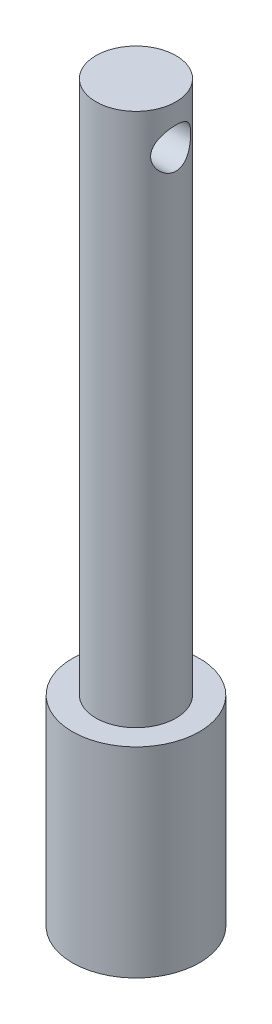
ISO-10303-21;
HEADER;
FILE_DESCRIPTION(('STEP AP214'),'2;1');
FILE_NAME('part.step','',(''),(''),'','','');
FILE_SCHEMA(('AUTOMOTIVE_DESIGN { 1 0 10303 214 1 1 1 1 }'));
ENDSEC;
DATA;
#1=APPLICATION_CONTEXT('core data for automotive mechanical design processes');
#2=APPLICATION_PROTOCOL_DEFINITION('international standard','automotive_design',2000,#1);
#3=PRODUCT_CONTEXT('',#1,'mechanical');
#4=PRODUCT('Part','Part','',(#3));
#5=PRODUCT_RELATED_PRODUCT_CATEGORY('part','',(#4));
#6=PRODUCT_DEFINITION_FORMATION('','',#4);
#7=PRODUCT_DEFINITION_CONTEXT('part definition',#1,'design');
#8=PRODUCT_DEFINITION('design','',#6,#7);
#9=PRODUCT_DEFINITION_SHAPE('','',#8);
#10=(LENGTH_UNIT() NAMED_UNIT(*) SI_UNIT(.MILLI.,.METRE.));
#11=(NAMED_UNIT(*) PLANE_ANGLE_UNIT() SI_UNIT($,.RADIAN.));
#12=(NAMED_UNIT(*) SI_UNIT($,.STERADIAN.) SOLID_ANGLE_UNIT());
#13=UNCERTAINTY_MEASURE_WITH_UNIT(LENGTH_MEASURE(1.E-05),#10,'distance_accuracy_value','');
#14=(GEOMETRIC_REPRESENTATION_CONTEXT(3) GLOBAL_UNCERTAINTY_ASSIGNED_CONTEXT((#13)) GLOBAL_UNIT_ASSIGNED_CONTEXT((#10,
#11,#12)) REPRESENTATION_CONTEXT('',''));
#15=CARTESIAN_POINT('',(0.,0.,0.));
#16=DIRECTION('',(0.,0.,1.));
#17=DIRECTION('',(1.,0.,0.));
#18=AXIS2_PLACEMENT_3D('',#15,#16,#17);
#19=CARTESIAN_POINT('',(0.,110.,0.));
#20=DIRECTION('',(0.,-1.,0.));
#21=DIRECTION('',(0.,0.,-1.));
#22=AXIS2_PLACEMENT_3D('',#19,#20,#21);
#23=CYLINDRICAL_SURFACE('',#22,6.);
#24=CARTESIAN_POINT('',(0.,30.,0.));
#25=DIRECTION('',(0.,1.,0.));
#26=DIRECTION('',(0.,0.,1.));
#27=AXIS2_PLACEMENT_3D('',#24,#25,#26);
#28=CIRCLE('',#27,6.);
#29=CARTESIAN_POINT('',(0.,30.,6.));
#30=VERTEX_POINT('',#29);
#31=EDGE_CURVE('E47',#30,#30,#28,.F.);
#32=ORIENTED_EDGE('',*,*,#31,.F.);
#33=EDGE_LOOP('',(#32));
#34=FACE_BOUND('',#33,.T.);
#35=CARTESIAN_POINT('',(0.,110.,0.));
#36=DIRECTION('',(0.,1.,0.));
#37=DIRECTION('',(0.,0.,1.));
#38=AXIS2_PLACEMENT_3D('',#35,#36,#37);
#39=CIRCLE('',#38,6.);
#40=CARTESIAN_POINT('',(0.,110.,6.));
#41=VERTEX_POINT('',#40);
#42=EDGE_CURVE('E51',#41,#41,#39,.T.);
#43=ORIENTED_EDGE('',*,*,#42,.F.);
#44=EDGE_LOOP('',(#43));
#45=FACE_BOUND('',#44,.T.);
#46=CARTESIAN_POINT('',(-5.19615242270663,104.,-3.));
#47=CARTESIAN_POINT('',(-5.19615338151414,103.921799766741,-2.99999910875738));
#48=CARTESIAN_POINT('',(-5.19792581191127,103.843590001535,-2.99693611207795));
#49=CARTESIAN_POINT('',(-5.20493931657123,103.687791924858,-2.98473565374509));
#50=CARTESIAN_POINT('',(-5.21018200566082,103.610203919731,-2.97559536411629));
#51=CARTESIAN_POINT('',(-5.23088200558207,103.379055985754,-2.9391691225804));
#52=CARTESIAN_POINT('',(-5.25131076607215,103.227249089467,-2.902878058149));
#53=CARTESIAN_POINT('',(-5.3024774692754,102.933608366476,-2.80829998089522));
#54=CARTESIAN_POINT('',(-5.33316051577918,102.791726198249,-2.75012989346617));
#55=CARTESIAN_POINT('',(-5.40128072966972,102.519737238299,-2.61380253964662));
#56=CARTESIAN_POINT('',(-5.43871826241347,102.389631084125,-2.53564419197538));
#57=CARTESIAN_POINT('',(-5.51990583559837,102.133079853852,-2.35399963256537));
#58=CARTESIAN_POINT('',(-5.56392184571631,102.007821797844,-2.24895611137364));
#59=CARTESIAN_POINT('',(-5.651159547025,101.77577563031,-2.01976141989962));
#60=CARTESIAN_POINT('',(-5.69438083245621,101.668996731743,-1.89560077655245));
#61=CARTESIAN_POINT('',(-5.77864428988888,101.469898312268,-1.62146869109162));
#62=CARTESIAN_POINT('',(-5.81934318752246,101.379038634073,-1.47032156718994));
#63=CARTESIAN_POINT('',(-5.89052268800541,101.224577502572,-1.15247107964639));
#64=CARTESIAN_POINT('',(-5.92100973690811,101.160958846753,-0.985777614653088));
#65=CARTESIAN_POINT('',(-5.96641383603058,101.067486002011,-0.654134831556281));
#66=CARTESIAN_POINT('',(-5.98228440595574,101.035551420352,-0.489905370480164));
#67=CARTESIAN_POINT('',(-6.00022751605263,100.999501644556,-0.157711887079228));
#68=CARTESIAN_POINT('',(-6.00230840492438,100.995369617868,0.010249813811041));
#69=CARTESIAN_POINT('',(-5.9928894562274,101.014240032635,0.329497576667925));
#70=CARTESIAN_POINT('',(-5.98255487247965,101.034914088078,0.480963609704595));
#71=CARTESIAN_POINT('',(-5.9512273620779,101.098642490196,0.777941303579847));
#72=CARTESIAN_POINT('',(-5.93023363786808,101.141698511578,0.923452517976636));
#73=CARTESIAN_POINT('',(-5.87914748253371,101.24924785577,1.20692822064063));
#74=CARTESIAN_POINT('',(-5.8489331854518,101.314029531201,1.34476044303003));
#75=CARTESIAN_POINT('',(-5.78212944004645,101.462789656708,1.60793023199369));
#76=CARTESIAN_POINT('',(-5.74553771044373,101.54677497951,1.73326330217192));
#77=CARTESIAN_POINT('',(-5.66533158492102,101.74068847394,1.98052168794678));
#78=CARTESIAN_POINT('',(-5.62138031742825,101.852318510642,2.10100497271935));
#79=CARTESIAN_POINT('',(-5.53363118085843,102.093759741909,2.32231036115799));
#80=CARTESIAN_POINT('',(-5.48983345502612,102.223584793896,2.42311733790259));
#81=CARTESIAN_POINT('',(-5.40432084665524,102.507982143341,2.6085269546345));
#82=CARTESIAN_POINT('',(-5.36291485750667,102.663602435646,2.691694028528));
#83=CARTESIAN_POINT('',(-5.30915194408667,102.907563054612,2.79542837524198));
#84=CARTESIAN_POINT('',(-5.2926194649543,102.990656310405,2.82650797342001));
#85=CARTESIAN_POINT('',(-5.26298473463269,103.159808603034,2.88131297532033));
#86=CARTESIAN_POINT('',(-5.24988036897854,103.245865774475,2.90504291399185));
#87=CARTESIAN_POINT('',(-5.22855455988393,103.413371620224,2.94323927983804));
#88=CARTESIAN_POINT('',(-5.22002982263214,103.494649425638,2.95828810706487));
#89=CARTESIAN_POINT('',(-5.20672737157291,103.658435238666,2.98163903200842));
#90=CARTESIAN_POINT('',(-5.20194770920409,103.740942583748,2.98994463830255));
#91=CARTESIAN_POINT('',(-5.19633662863608,103.906471006803,2.99968663811345));
#92=CARTESIAN_POINT('',(-5.19550374026212,103.989491881944,3.00112558946313));
#93=CARTESIAN_POINT('',(-5.19780953199967,104.155286460765,2.99712742537403));
#94=CARTESIAN_POINT('',(-5.20094794403249,104.238060180751,2.99169077406597));
#95=CARTESIAN_POINT('',(-5.21504493010247,104.466859136043,2.96710135231213));
#96=CARTESIAN_POINT('',(-5.23019160660498,104.611910810263,2.9405616310018));
#97=CARTESIAN_POINT('',(-5.27081666384497,104.895130910797,2.86709067362229));
#98=CARTESIAN_POINT('',(-5.29629839028765,105.03329709183,2.82015283383763));
#99=CARTESIAN_POINT('',(-5.35608780273032,105.30622610392,2.70494224478442));
#100=CARTESIAN_POINT('',(-5.3907496041273,105.440534927904,2.63578205088436));
#101=CARTESIAN_POINT('',(-5.46468327792416,105.696409938366,2.47886133231339));
#102=CARTESIAN_POINT('',(-5.50395751387985,105.817969530811,2.39109125263821));
#103=CARTESIAN_POINT('',(-5.58864005140301,106.060935626632,2.18651145695799));
#104=CARTESIAN_POINT('',(-5.63419752084738,106.1803912709,2.067435804994));
#105=CARTESIAN_POINT('',(-5.72202702310923,106.398236895295,1.81021349814979));
#106=CARTESIAN_POINT('',(-5.76429794308225,106.496619759675,1.67206042712514));
#107=CARTESIAN_POINT('',(-5.84224085806642,106.671721127574,1.37560608443378));
#108=CARTESIAN_POINT('',(-5.87770925226883,106.747799341883,1.21686929217554));
#109=CARTESIAN_POINT('',(-5.93650064667294,106.871413724311,0.886567094469531));
#110=CARTESIAN_POINT('',(-5.95983430919533,106.918974954842,0.715013103123992));
#111=CARTESIAN_POINT('',(-5.9900252464518,106.980105691849,0.380939047947186));
#112=CARTESIAN_POINT('',(-5.99819783930701,106.996393635561,0.219034335650382));
#113=CARTESIAN_POINT('',(-6.00126390919338,107.002529788434,-0.105377961951206));
#114=CARTESIAN_POINT('',(-5.99616203476054,106.992387253183,-0.267885316317466));
#115=CARTESIAN_POINT('',(-5.97401907190636,106.947750809866,-0.577613962536146));
#116=CARTESIAN_POINT('',(-5.95778686442443,106.914905562334,-0.725136901247731));
#117=CARTESIAN_POINT('',(-5.91576278551446,106.828018891968,-1.01233790874442));
#118=CARTESIAN_POINT('',(-5.88996954319456,106.773974429458,-1.15201484923629));
#119=CARTESIAN_POINT('',(-5.829778017116,106.643819271311,-1.42627001605164));
#120=CARTESIAN_POINT('',(-5.79505887623287,106.566863658464,-1.56037465678412));
#121=CARTESIAN_POINT('',(-5.72064363382009,106.394124578586,-1.81432469711303));
#122=CARTESIAN_POINT('',(-5.6809452494399,106.298332464011,-1.93416350676914));
#123=CARTESIAN_POINT('',(-5.59585978819439,106.079615277516,-2.16873884087783));
#124=CARTESIAN_POINT('',(-5.55029975504518,105.954938679226,-2.28178066887876));
#125=CARTESIAN_POINT('',(-5.46188649509677,105.68762167193,-2.48600225783029));
#126=CARTESIAN_POINT('',(-5.41903568750871,105.544965538969,-2.57716267726706));
#127=CARTESIAN_POINT('',(-5.36004774906988,105.317468206698,-2.6966555934249));
#128=CARTESIAN_POINT('',(-5.34101219148464,105.238024199018,-2.73405408762355));
#129=CARTESIAN_POINT('',(-5.30572783063718,105.075646716991,-2.80191257626505));
#130=CARTESIAN_POINT('',(-5.28947759301443,104.992715066252,-2.83237614466584));
#131=CARTESIAN_POINT('',(-5.26045215868185,104.82415526763,-2.88592624586959));
#132=CARTESIAN_POINT('',(-5.24766803509091,104.738534692759,-2.90903175649395));
#133=CARTESIAN_POINT('',(-5.22608869625113,104.565144744686,-2.9476242805163));
#134=CARTESIAN_POINT('',(-5.21729069243665,104.477376919079,-2.96311662049621));
#135=CARTESIAN_POINT('',(-5.20588528016133,104.32460118224,-2.98309381225721));
#136=CARTESIAN_POINT('',(-5.20224442588138,104.259905191093,-2.98942746228381));
#137=CARTESIAN_POINT('',(-5.19737751744686,104.1301416832,-2.99788106792142));
#138=CARTESIAN_POINT('',(-5.1961516248372,104.065074141892,-3.00000074164548));
#139=CARTESIAN_POINT('',(-5.19615242270663,104.,-3.));
#140=B_SPLINE_CURVE_WITH_KNOTS('',3,(#46,#47,#48,#49,#50,#51,#52,#53,#54,#55,#56,#57,#58,#59,
#60,#61,#62,#63,#64,#65,#66,#67,#68,#69,#70,#71,#72,#73,#74,#75,#76,#77,#78,#79,#80,#81,#82,#83,
#84,#85,#86,#87,#88,#89,#90,#91,#92,#93,#94,#95,#96,#97,#98,#99,#100,#101,#102,#103,#104,#105,
#106,#107,#108,#109,#110,#111,#112,#113,#114,#115,#116,#117,#118,#119,#120,#121,#122,#123,#124,
#125,#126,#127,#128,#129,#130,#131,#132,#133,#134,#135,#136,#137,#138,#139),.UNSPECIFIED.,.T.,
.F.,(4,2,2,2,2,2,2,2,2,2,2,2,2,2,2,2,2,2,2,2,2,2,2,2,2,2,2,2,2,2,2,2,2,2,2,2,2,2,2,2,2,2,2,2,2,
2,4),(0.,0.234529430733901,0.469168072604274,0.938850383294538,1.40605749261243,
1.87328988121655,2.37905864237582,2.88507883741225,3.42520847204403,3.96499651379786,
4.46637625391918,4.96745241546233,5.42495462941728,5.88249108040478,6.34635774681553,
6.81039068538929,7.31828744858785,7.82657315225868,8.36713695676457,8.63752916119814,
8.90775419202328,9.15669600787594,9.40550821320573,9.65422772860787,9.9029304553422,
10.3454331624118,10.7880792327729,11.2512265518736,11.7146122462924,12.2364099671094,
12.7583836090371,13.29413310208,13.8294110539542,14.3155757713756,14.8015702635102,
15.2555404058358,15.7095756650514,16.1830301812752,16.6567025627126,17.1775149151931,
17.6987859450456,17.968011589323,18.2370981707631,18.5054849980179,18.7736837791728,
18.9688338446807,19.1639969639895),.UNSPECIFIED.);
#141=CARTESIAN_POINT('',(-5.19615242270663,104.,-3.));
#142=VERTEX_POINT('',#141);
#143=EDGE_CURVE('E62',#142,#142,#140,.T.);
#144=ORIENTED_EDGE('',*,*,#143,.F.);
#145=EDGE_LOOP('',(#144));
#146=FACE_BOUND('',#145,.T.);
#147=CARTESIAN_POINT('',(5.19615242270663,104.,3.));
#148=CARTESIAN_POINT('',(5.19615338151414,104.078200233259,2.99999910875738));
#149=CARTESIAN_POINT('',(5.19792581191127,104.156409998465,2.99693611207795));
#150=CARTESIAN_POINT('',(5.20493931657123,104.312208075142,2.98473565374509));
#151=CARTESIAN_POINT('',(5.21018200566082,104.389796080269,2.97559536411629));
#152=CARTESIAN_POINT('',(5.23088200558207,104.620944014246,2.9391691225804));
#153=CARTESIAN_POINT('',(5.25131076607215,104.772750910533,2.902878058149));
#154=CARTESIAN_POINT('',(5.3024774692754,105.066391633524,2.80829998089523));
#155=CARTESIAN_POINT('',(5.33316051577918,105.208273801751,2.75012989346618));
#156=CARTESIAN_POINT('',(5.40128072966972,105.480262761701,2.61380253964663));
#157=CARTESIAN_POINT('',(5.43871826241347,105.610368915875,2.53564419197538));
#158=CARTESIAN_POINT('',(5.51990583559837,105.866920146148,2.35399963256537));
#159=CARTESIAN_POINT('',(5.56392184571631,105.992178202156,2.24895611137364));
#160=CARTESIAN_POINT('',(5.651159547025,106.22422436969,2.01976141989962));
#161=CARTESIAN_POINT('',(5.69438083245621,106.331003268257,1.89560077655245));
#162=CARTESIAN_POINT('',(5.77864428988888,106.530101687732,1.62146869109162));
#163=CARTESIAN_POINT('',(5.81934318752246,106.620961365927,1.47032156718994));
#164=CARTESIAN_POINT('',(5.89052268800541,106.775422497428,1.15247107964639));
#165=CARTESIAN_POINT('',(5.92100973690811,106.839041153247,0.985777614653088));
#166=CARTESIAN_POINT('',(5.96641383603058,106.932513997989,0.654134831556281));
#167=CARTESIAN_POINT('',(5.98228440595574,106.964448579648,0.489905370480165));
#168=CARTESIAN_POINT('',(6.00022751605263,107.000498355444,0.157711887079229));
#169=CARTESIAN_POINT('',(6.00230840492438,107.004630382132,-0.0102498138110404));
#170=CARTESIAN_POINT('',(5.9928894562274,106.985759967365,-0.329497576667925));
#171=CARTESIAN_POINT('',(5.98255487247965,106.965085911922,-0.480963609704595));
#172=CARTESIAN_POINT('',(5.9512273620779,106.901357509804,-0.777941303579847));
#173=CARTESIAN_POINT('',(5.93023363786808,106.858301488422,-0.923452517976636));
#174=CARTESIAN_POINT('',(5.87914748253371,106.75075214423,-1.20692822064063));
#175=CARTESIAN_POINT('',(5.8489331854518,106.685970468799,-1.34476044303003));
#176=CARTESIAN_POINT('',(5.78212944004645,106.537210343292,-1.60793023199369));
#177=CARTESIAN_POINT('',(5.74553771044373,106.45322502049,-1.73326330217192));
#178=CARTESIAN_POINT('',(5.66533158492102,106.25931152606,-1.98052168794678));
#179=CARTESIAN_POINT('',(5.62138031742825,106.147681489358,-2.10100497271935));
#180=CARTESIAN_POINT('',(5.53363118085843,105.906240258091,-2.32231036115799));
#181=CARTESIAN_POINT('',(5.48983345502612,105.776415206104,-2.42311733790259));
#182=CARTESIAN_POINT('',(5.40432084665524,105.492017856659,-2.6085269546345));
#183=CARTESIAN_POINT('',(5.36291485750667,105.336397564354,-2.691694028528));
#184=CARTESIAN_POINT('',(5.30915194408667,105.092436945388,-2.79542837524198));
#185=CARTESIAN_POINT('',(5.2926194649543,105.009343689595,-2.82650797342001));
#186=CARTESIAN_POINT('',(5.26298473463269,104.840191396966,-2.88131297532033));
#187=CARTESIAN_POINT('',(5.24988036897854,104.754134225525,-2.90504291399186));
#188=CARTESIAN_POINT('',(5.22855455988393,104.586628379776,-2.94323927983804));
#189=CARTESIAN_POINT('',(5.22002982263214,104.505350574362,-2.95828810706486));
#190=CARTESIAN_POINT('',(5.20672737157291,104.341564761334,-2.98163903200842));
#191=CARTESIAN_POINT('',(5.20194770920409,104.259057416252,-2.98994463830255));
#192=CARTESIAN_POINT('',(5.19633662863608,104.093528993197,-2.99968663811345));
#193=CARTESIAN_POINT('',(5.19550374026212,104.010508118056,-3.00112558946313));
#194=CARTESIAN_POINT('',(5.19780953199967,103.844713539235,-2.99712742537403));
#195=CARTESIAN_POINT('',(5.20094794403249,103.761939819249,-2.99169077406597));
#196=CARTESIAN_POINT('',(5.21504493010247,103.533140863957,-2.96710135231213));
#197=CARTESIAN_POINT('',(5.23019160660498,103.388089189737,-2.9405616310018));
#198=CARTESIAN_POINT('',(5.27081666384497,103.104869089203,-2.86709067362229));
#199=CARTESIAN_POINT('',(5.29629839028765,102.96670290817,-2.82015283383763));
#200=CARTESIAN_POINT('',(5.35608780273032,102.69377389608,-2.70494224478442));
#201=CARTESIAN_POINT('',(5.39074960412731,102.559465072096,-2.63578205088435));
#202=CARTESIAN_POINT('',(5.46468327792416,102.303590061634,-2.47886133231337));
#203=CARTESIAN_POINT('',(5.50395751387985,102.182030469189,-2.3910912526382));
#204=CARTESIAN_POINT('',(5.58864005140302,101.939064373368,-2.18651145695799));
#205=CARTESIAN_POINT('',(5.63419752084738,101.8196087291,-2.06743580499399));
#206=CARTESIAN_POINT('',(5.72202702310923,101.601763104705,-1.81021349814978));
#207=CARTESIAN_POINT('',(5.76429794308225,101.503380240324,-1.67206042712513));
#208=CARTESIAN_POINT('',(5.84224085806642,101.328278872426,-1.37560608443378));
#209=CARTESIAN_POINT('',(5.87770925226883,101.252200658117,-1.21686929217555));
#210=CARTESIAN_POINT('',(5.93650064667294,101.128586275689,-0.886567094469544));
#211=CARTESIAN_POINT('',(5.95983430919533,101.081025045158,-0.715013103123998));
#212=CARTESIAN_POINT('',(5.9900252464518,101.019894308151,-0.380939047947186));
#213=CARTESIAN_POINT('',(5.99819783930701,101.003606364439,-0.219034335650381));
#214=CARTESIAN_POINT('',(6.00126390919338,100.997470211566,0.105377961951206));
#215=CARTESIAN_POINT('',(5.99616203476054,101.007612746817,0.267885316317466));
#216=CARTESIAN_POINT('',(5.97401907190636,101.052249190134,0.577613962536146));
#217=CARTESIAN_POINT('',(5.95778686442443,101.085094437666,0.725136901247732));
#218=CARTESIAN_POINT('',(5.91576278551446,101.171981108032,1.01233790874442));
#219=CARTESIAN_POINT('',(5.88996954319456,101.226025570542,1.15201484923629));
#220=CARTESIAN_POINT('',(5.829778017116,101.356180728689,1.42627001605164));
#221=CARTESIAN_POINT('',(5.79505887623287,101.433136341536,1.56037465678412));
#222=CARTESIAN_POINT('',(5.72064363382009,101.605875421414,1.81432469711303));
#223=CARTESIAN_POINT('',(5.6809452494399,101.701667535989,1.93416350676914));
#224=CARTESIAN_POINT('',(5.59585978819439,101.920384722484,2.16873884087783));
#225=CARTESIAN_POINT('',(5.55029975504518,102.045061320774,2.28178066887876));
#226=CARTESIAN_POINT('',(5.46188649509677,102.31237832807,2.48600225783029));
#227=CARTESIAN_POINT('',(5.41903568750871,102.455034461031,2.57716267726706));
#228=CARTESIAN_POINT('',(5.36004774906988,102.682531793302,2.6966555934249));
#229=CARTESIAN_POINT('',(5.34101219148464,102.761975800982,2.73405408762355));
#230=CARTESIAN_POINT('',(5.30572783063718,102.924353283009,2.80191257626505));
#231=CARTESIAN_POINT('',(5.28947759301443,103.007284933748,2.83237614466584));
#232=CARTESIAN_POINT('',(5.26045215868185,103.17584473237,2.88592624586959));
#233=CARTESIAN_POINT('',(5.24766803509091,103.261465307241,2.90903175649395));
#234=CARTESIAN_POINT('',(5.22608869625113,103.434855255314,2.9476242805163));
#235=CARTESIAN_POINT('',(5.21729069243665,103.522623080921,2.96311662049621));
#236=CARTESIAN_POINT('',(5.20588528016133,103.67539881776,2.98309381225721));
#237=CARTESIAN_POINT('',(5.20224442588138,103.740094808907,2.98942746228381));
#238=CARTESIAN_POINT('',(5.19737751744686,103.8698583168,2.99788106792142));
#239=CARTESIAN_POINT('',(5.1961516248372,103.934925858108,3.00000074164548));
#240=CARTESIAN_POINT('',(5.19615242270663,104.,3.));
#241=B_SPLINE_CURVE_WITH_KNOTS('',3,(#147,#148,#149,#150,#151,#152,#153,#154,#155,#156,#157,
#158,#159,#160,#161,#162,#163,#164,#165,#166,#167,#168,#169,#170,#171,#172,#173,#174,#175,#176,
#177,#178,#179,#180,#181,#182,#183,#184,#185,#186,#187,#188,#189,#190,#191,#192,#193,#194,#195,
#196,#197,#198,#199,#200,#201,#202,#203,#204,#205,#206,#207,#208,#209,#210,#211,#212,#213,#214,
#215,#216,#217,#218,#219,#220,#221,#222,#223,#224,#225,#226,#227,#228,#229,#230,#231,#232,#233,
#234,#235,#236,#237,#238,#239,#240),.UNSPECIFIED.,.T.,.F.,(4,2,2,2,2,2,2,2,2,2,2,2,2,2,2,2,2,2,
2,2,2,2,2,2,2,2,2,2,2,2,2,2,2,2,2,2,2,2,2,2,2,2,2,2,2,2,4),(0.,0.234529430733901,
0.469168072604274,0.938850383294538,1.4060574926124,1.87328988121655,2.37905864237582,
2.88507883741225,3.42520847204403,3.96499651379786,4.46637625391918,4.96745241546233,
5.42495462941728,5.88249108040478,6.34635774681553,6.81039068538929,7.31828744858785,
7.82657315225868,8.36713695676457,8.63752916119814,8.90775419202328,9.15669600787593,
9.40550821320573,9.65422772860784,9.9029304553422,10.3454331624118,10.7880792327729,
11.2512265518737,11.7146122462924,12.2364099671094,12.7583836090371,13.29413310208,
13.8294110539542,14.3155757713756,14.8015702635102,15.2555404058358,15.7095756650514,
16.1830301812752,16.6567025627126,17.1775149151931,17.6987859450456,17.968011589323,
18.2370981707631,18.5054849980179,18.7736837791728,18.9688338446807,19.1639969639895),.UNSPECIFIED.);
#242=CARTESIAN_POINT('',(5.19615242270663,104.,3.));
#243=VERTEX_POINT('',#242);
#244=EDGE_CURVE('E54',#243,#243,#241,.T.);
#245=ORIENTED_EDGE('',*,*,#244,.T.);
#246=EDGE_LOOP('',(#245));
#247=FACE_BOUND('',#246,.T.);
#248=ADVANCED_FACE('F36',(#34,#45,#146,#247),#23,.T.);
#249=CARTESIAN_POINT('',(0.,30.,0.));
#250=DIRECTION('',(0.,-1.,0.));
#251=DIRECTION('',(0.,0.,-1.));
#252=AXIS2_PLACEMENT_3D('',#249,#250,#251);
#253=CYLINDRICAL_SURFACE('',#252,9.525);
#254=CARTESIAN_POINT('',(0.,30.,0.));
#255=DIRECTION('',(0.,1.,0.));
#256=DIRECTION('',(0.,0.,1.));
#257=AXIS2_PLACEMENT_3D('',#254,#255,#256);
#258=CIRCLE('',#257,9.525);
#259=CARTESIAN_POINT('',(0.,30.,9.525));
#260=VERTEX_POINT('',#259);
#261=EDGE_CURVE('E10',#260,#260,#258,.T.);
#262=ORIENTED_EDGE('',*,*,#261,.F.);
#263=EDGE_LOOP('',(#262));
#264=FACE_BOUND('',#263,.T.);
#265=CARTESIAN_POINT('',(0.,0.,0.));
#266=DIRECTION('',(0.,1.,0.));
#267=DIRECTION('',(0.,0.,1.));
#268=AXIS2_PLACEMENT_3D('',#265,#266,#267);
#269=CIRCLE('',#268,9.525);
#270=CARTESIAN_POINT('',(0.,0.,9.525));
#271=VERTEX_POINT('',#270);
#272=EDGE_CURVE('E40',#271,#271,#269,.T.);
#273=ORIENTED_EDGE('',*,*,#272,.T.);
#274=EDGE_LOOP('',(#273));
#275=FACE_BOUND('',#274,.T.);
#276=ADVANCED_FACE('F38',(#264,#275),#253,.T.);
#277=CARTESIAN_POINT('',(0.,30.,0.));
#278=DIRECTION('',(0.,1.,0.));
#279=DIRECTION('',(0.,0.,1.));
#280=AXIS2_PLACEMENT_3D('',#277,#278,#279);
#281=PLANE('',#280);
#282=ORIENTED_EDGE('',*,*,#31,.T.);
#283=EDGE_LOOP('',(#282));
#284=FACE_BOUND('',#283,.T.);
#285=ORIENTED_EDGE('',*,*,#261,.T.);
#286=EDGE_LOOP('',(#285));
#287=FACE_BOUND('',#286,.T.);
#288=ADVANCED_FACE('F84',(#284,#287),#281,.T.);
#289=CARTESIAN_POINT('',(0.,0.,0.));
#290=DIRECTION('',(0.,1.,0.));
#291=DIRECTION('',(0.,0.,1.));
#292=AXIS2_PLACEMENT_3D('',#289,#290,#291);
#293=PLANE('',#292);
#294=ORIENTED_EDGE('',*,*,#272,.F.);
#295=EDGE_LOOP('',(#294));
#296=FACE_BOUND('',#295,.T.);
#297=ADVANCED_FACE('F79',(#296),#293,.F.);
#298=CARTESIAN_POINT('',(0.,110.,0.));
#299=DIRECTION('',(0.,1.,0.));
#300=DIRECTION('',(0.,0.,1.));
#301=AXIS2_PLACEMENT_3D('',#298,#299,#300);
#302=PLANE('',#301);
#303=ORIENTED_EDGE('',*,*,#42,.T.);
#304=EDGE_LOOP('',(#303));
#305=FACE_BOUND('',#304,.T.);
#306=ADVANCED_FACE('F75',(#305),#302,.T.);
#307=CARTESIAN_POINT('',(9.526,104.,0.));
#308=DIRECTION('',(-1.,0.,0.));
#309=DIRECTION('',(0.,0.,1.));
#310=AXIS2_PLACEMENT_3D('',#307,#308,#309);
#311=CYLINDRICAL_SURFACE('',#310,3.);
#312=ORIENTED_EDGE('',*,*,#244,.F.);
#313=EDGE_LOOP('',(#312));
#314=FACE_BOUND('',#313,.T.);
#315=ORIENTED_EDGE('',*,*,#143,.T.);
#316=EDGE_LOOP('',(#315));
#317=FACE_BOUND('',#316,.T.);
#318=ADVANCED_FACE('F68',(#314,#317),#311,.F.);
#319=CLOSED_SHELL('',(#248,#276,#288,#297,#306,#318));
#320=MANIFOLD_SOLID_BREP('B2',#319);
#321=ADVANCED_BREP_SHAPE_REPRESENTATION('',(#18,#320),#14);
#322=SHAPE_DEFINITION_REPRESENTATION(#9,#321);
ENDSEC;
END-ISO-10303-21;
